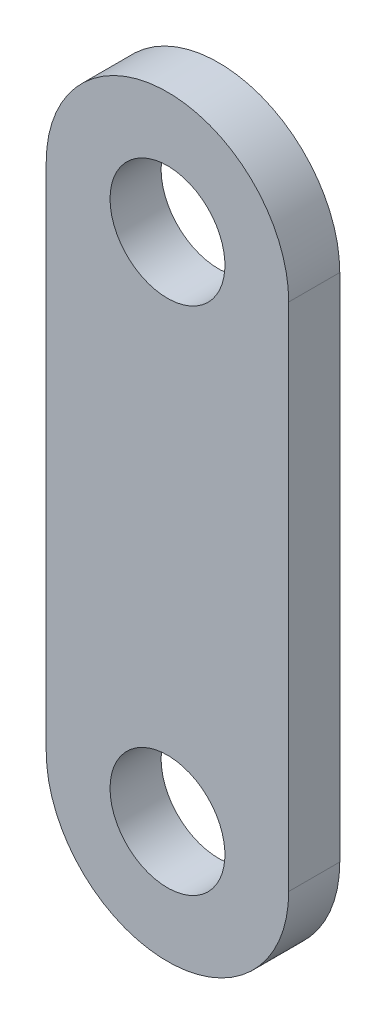
ISO-10303-21;
HEADER;
FILE_DESCRIPTION(('STEP AP214'),'2;1');
FILE_NAME('part.step','',(''),(''),'','','');
FILE_SCHEMA(('AUTOMOTIVE_DESIGN { 1 0 10303 214 1 1 1 1 }'));
ENDSEC;
DATA;
#1=APPLICATION_CONTEXT('core data for automotive mechanical design processes');
#2=APPLICATION_PROTOCOL_DEFINITION('international standard','automotive_design',2000,#1);
#3=PRODUCT_CONTEXT('',#1,'mechanical');
#4=PRODUCT('Part','Part','',(#3));
#5=PRODUCT_RELATED_PRODUCT_CATEGORY('part','',(#4));
#6=PRODUCT_DEFINITION_FORMATION('','',#4);
#7=PRODUCT_DEFINITION_CONTEXT('part definition',#1,'design');
#8=PRODUCT_DEFINITION('design','',#6,#7);
#9=PRODUCT_DEFINITION_SHAPE('','',#8);
#10=(LENGTH_UNIT() NAMED_UNIT(*) SI_UNIT(.MILLI.,.METRE.));
#11=(NAMED_UNIT(*) PLANE_ANGLE_UNIT() SI_UNIT($,.RADIAN.));
#12=(NAMED_UNIT(*) SI_UNIT($,.STERADIAN.) SOLID_ANGLE_UNIT());
#13=UNCERTAINTY_MEASURE_WITH_UNIT(LENGTH_MEASURE(1.E-05),#10,'distance_accuracy_value','');
#14=(GEOMETRIC_REPRESENTATION_CONTEXT(3) GLOBAL_UNCERTAINTY_ASSIGNED_CONTEXT((#13)) GLOBAL_UNIT_ASSIGNED_CONTEXT((#10,
#11,#12)) REPRESENTATION_CONTEXT('',''));
#15=CARTESIAN_POINT('',(0.,0.,0.));
#16=DIRECTION('',(0.,0.,1.));
#17=DIRECTION('',(1.,0.,0.));
#18=AXIS2_PLACEMENT_3D('',#15,#16,#17);
#19=CARTESIAN_POINT('',(0.,-20.,4.));
#20=DIRECTION('',(0.,0.,-1.));
#21=DIRECTION('',(-1.,0.,0.));
#22=AXIS2_PLACEMENT_3D('',#19,#20,#21);
#23=CYLINDRICAL_SURFACE('',#22,9.5);
#24=CARTESIAN_POINT('',(0.,-20.,0.));
#25=DIRECTION('',(0.,0.,1.));
#26=DIRECTION('',(1.,0.,0.));
#27=AXIS2_PLACEMENT_3D('',#24,#25,#26);
#28=CIRCLE('',#27,9.5);
#29=CARTESIAN_POINT('',(-9.49999999999999,-20.,0.));
#30=VERTEX_POINT('',#29);
#31=CARTESIAN_POINT('',(9.50000000000001,-20.,0.));
#32=VERTEX_POINT('',#31);
#33=EDGE_CURVE('E111',#30,#32,#28,.T.);
#34=ORIENTED_EDGE('',*,*,#33,.T.);
#35=DIRECTION('',(0.,0.,-1.));
#36=VECTOR('',#35,1.);
#37=CARTESIAN_POINT('',(9.50000000000001,-20.,4.));
#38=LINE('',#37,#36);
#39=CARTESIAN_POINT('',(9.50000000000001,-20.,4.));
#40=VERTEX_POINT('',#39);
#41=EDGE_CURVE('E13',#40,#32,#38,.T.);
#42=ORIENTED_EDGE('',*,*,#41,.F.);
#43=CARTESIAN_POINT('',(0.,-20.,4.));
#44=DIRECTION('',(0.,0.,1.));
#45=DIRECTION('',(1.,0.,0.));
#46=AXIS2_PLACEMENT_3D('',#43,#44,#45);
#47=CIRCLE('',#46,9.5);
#48=CARTESIAN_POINT('',(-9.49999999999999,-20.,4.));
#49=VERTEX_POINT('',#48);
#50=EDGE_CURVE('E99',#49,#40,#47,.T.);
#51=ORIENTED_EDGE('',*,*,#50,.F.);
#52=DIRECTION('',(0.,0.,-1.));
#53=VECTOR('',#52,1.);
#54=CARTESIAN_POINT('',(-9.49999999999999,-20.,4.));
#55=LINE('',#54,#53);
#56=EDGE_CURVE('E107',#49,#30,#55,.T.);
#57=ORIENTED_EDGE('',*,*,#56,.T.);
#58=EDGE_LOOP('',(#34,#42,#51,#57));
#59=FACE_BOUND('',#58,.T.);
#60=ADVANCED_FACE('F48',(#59),#23,.T.);
#61=CARTESIAN_POINT('',(9.50000000000001,-20.,4.));
#62=DIRECTION('',(-1.,0.,0.));
#63=DIRECTION('',(0.,-1.,0.));
#64=AXIS2_PLACEMENT_3D('',#61,#62,#63);
#65=PLANE('',#64);
#66=DIRECTION('',(0.,1.,0.));
#67=VECTOR('',#66,1.);
#68=CARTESIAN_POINT('',(9.50000000000001,-20.,0.));
#69=LINE('',#68,#67);
#70=CARTESIAN_POINT('',(9.49999999999999,20.,0.));
#71=VERTEX_POINT('',#70);
#72=EDGE_CURVE('E103',#32,#71,#69,.T.);
#73=ORIENTED_EDGE('',*,*,#72,.T.);
#74=DIRECTION('',(0.,0.,-1.));
#75=VECTOR('',#74,1.);
#76=CARTESIAN_POINT('',(9.49999999999999,20.,4.));
#77=LINE('',#76,#75);
#78=CARTESIAN_POINT('',(9.49999999999999,20.,4.));
#79=VERTEX_POINT('',#78);
#80=EDGE_CURVE('E56',#79,#71,#77,.T.);
#81=ORIENTED_EDGE('',*,*,#80,.F.);
#82=DIRECTION('',(0.,1.,0.));
#83=VECTOR('',#82,1.);
#84=CARTESIAN_POINT('',(9.50000000000001,-20.,4.));
#85=LINE('',#84,#83);
#86=EDGE_CURVE('E94',#40,#79,#85,.T.);
#87=ORIENTED_EDGE('',*,*,#86,.F.);
#88=ORIENTED_EDGE('',*,*,#41,.T.);
#89=EDGE_LOOP('',(#73,#81,#87,#88));
#90=FACE_BOUND('',#89,.T.);
#91=ADVANCED_FACE('F102',(#90),#65,.F.);
#92=CARTESIAN_POINT('',(0.,20.,4.));
#93=DIRECTION('',(0.,0.,-1.));
#94=DIRECTION('',(-1.,0.,0.));
#95=AXIS2_PLACEMENT_3D('',#92,#93,#94);
#96=CYLINDRICAL_SURFACE('',#95,9.5);
#97=CARTESIAN_POINT('',(0.,20.,0.));
#98=DIRECTION('',(0.,0.,1.));
#99=DIRECTION('',(1.,0.,0.));
#100=AXIS2_PLACEMENT_3D('',#97,#98,#99);
#101=CIRCLE('',#100,9.5);
#102=CARTESIAN_POINT('',(-9.5,20.,0.));
#103=VERTEX_POINT('',#102);
#104=EDGE_CURVE('E81',#71,#103,#101,.T.);
#105=ORIENTED_EDGE('',*,*,#104,.T.);
#106=DIRECTION('',(0.,0.,-1.));
#107=VECTOR('',#106,1.);
#108=CARTESIAN_POINT('',(-9.5,20.,4.));
#109=LINE('',#108,#107);
#110=CARTESIAN_POINT('',(-9.5,20.,4.));
#111=VERTEX_POINT('',#110);
#112=EDGE_CURVE('E104',#111,#103,#109,.T.);
#113=ORIENTED_EDGE('',*,*,#112,.F.);
#114=CARTESIAN_POINT('',(0.,20.,4.));
#115=DIRECTION('',(0.,0.,1.));
#116=DIRECTION('',(1.,0.,0.));
#117=AXIS2_PLACEMENT_3D('',#114,#115,#116);
#118=CIRCLE('',#117,9.5);
#119=EDGE_CURVE('E97',#79,#111,#118,.T.);
#120=ORIENTED_EDGE('',*,*,#119,.F.);
#121=ORIENTED_EDGE('',*,*,#80,.T.);
#122=EDGE_LOOP('',(#105,#113,#120,#121));
#123=FACE_BOUND('',#122,.T.);
#124=ADVANCED_FACE('F105',(#123),#96,.T.);
#125=CARTESIAN_POINT('',(-9.49999999999999,-20.,4.));
#126=DIRECTION('',(1.,0.,0.));
#127=DIRECTION('',(0.,1.,0.));
#128=AXIS2_PLACEMENT_3D('',#125,#126,#127);
#129=PLANE('',#128);
#130=DIRECTION('',(0.,-1.,0.));
#131=VECTOR('',#130,1.);
#132=CARTESIAN_POINT('',(-9.49999999999999,-20.,0.));
#133=LINE('',#132,#131);
#134=EDGE_CURVE('E87',#103,#30,#133,.T.);
#135=ORIENTED_EDGE('',*,*,#134,.T.);
#136=ORIENTED_EDGE('',*,*,#56,.F.);
#137=DIRECTION('',(0.,-1.,0.));
#138=VECTOR('',#137,1.);
#139=CARTESIAN_POINT('',(-9.49999999999999,-20.,4.));
#140=LINE('',#139,#138);
#141=EDGE_CURVE('E64',#111,#49,#140,.T.);
#142=ORIENTED_EDGE('',*,*,#141,.F.);
#143=ORIENTED_EDGE('',*,*,#112,.T.);
#144=EDGE_LOOP('',(#135,#136,#142,#143));
#145=FACE_BOUND('',#144,.T.);
#146=ADVANCED_FACE('F119',(#145),#129,.F.);
#147=CARTESIAN_POINT('',(0.,-20.,4.));
#148=DIRECTION('',(0.,0.,1.));
#149=DIRECTION('',(1.,0.,0.));
#150=AXIS2_PLACEMENT_3D('',#147,#148,#149);
#151=PLANE('',#150);
#152=CARTESIAN_POINT('',(0.,20.,4.));
#153=DIRECTION('',(0.,0.,-1.));
#154=DIRECTION('',(-1.,0.,0.));
#155=AXIS2_PLACEMENT_3D('',#152,#153,#154);
#156=CIRCLE('',#155,4.49999999999999);
#157=CARTESIAN_POINT('',(-4.49999999999999,20.,4.));
#158=VERTEX_POINT('',#157);
#159=EDGE_CURVE('E114',#158,#158,#156,.T.);
#160=ORIENTED_EDGE('',*,*,#159,.T.);
#161=EDGE_LOOP('',(#160));
#162=FACE_BOUND('',#161,.T.);
#163=CARTESIAN_POINT('',(0.,-20.,4.));
#164=DIRECTION('',(0.,0.,-1.));
#165=DIRECTION('',(-1.,0.,0.));
#166=AXIS2_PLACEMENT_3D('',#163,#164,#165);
#167=CIRCLE('',#166,4.5);
#168=CARTESIAN_POINT('',(-4.5,-20.,4.));
#169=VERTEX_POINT('',#168);
#170=EDGE_CURVE('E128',#169,#169,#167,.T.);
#171=ORIENTED_EDGE('',*,*,#170,.T.);
#172=EDGE_LOOP('',(#171));
#173=FACE_BOUND('',#172,.T.);
#174=ORIENTED_EDGE('',*,*,#50,.T.);
#175=ORIENTED_EDGE('',*,*,#86,.T.);
#176=ORIENTED_EDGE('',*,*,#119,.T.);
#177=ORIENTED_EDGE('',*,*,#141,.T.);
#178=EDGE_LOOP('',(#174,#175,#176,#177));
#179=FACE_BOUND('',#178,.T.);
#180=ADVANCED_FACE('F95',(#162,#173,#179),#151,.T.);
#181=CARTESIAN_POINT('',(0.,-20.,0.));
#182=DIRECTION('',(0.,0.,1.));
#183=DIRECTION('',(1.,0.,0.));
#184=AXIS2_PLACEMENT_3D('',#181,#182,#183);
#185=PLANE('',#184);
#186=CARTESIAN_POINT('',(0.,20.,0.));
#187=DIRECTION('',(0.,0.,-1.));
#188=DIRECTION('',(-1.,0.,0.));
#189=AXIS2_PLACEMENT_3D('',#186,#187,#188);
#190=CIRCLE('',#189,4.49999999999999);
#191=CARTESIAN_POINT('',(-4.49999999999999,20.,0.));
#192=VERTEX_POINT('',#191);
#193=EDGE_CURVE('E131',#192,#192,#190,.T.);
#194=ORIENTED_EDGE('',*,*,#193,.F.);
#195=EDGE_LOOP('',(#194));
#196=FACE_BOUND('',#195,.T.);
#197=CARTESIAN_POINT('',(0.,-20.,0.));
#198=DIRECTION('',(0.,0.,-1.));
#199=DIRECTION('',(-1.,0.,0.));
#200=AXIS2_PLACEMENT_3D('',#197,#198,#199);
#201=CIRCLE('',#200,4.5);
#202=CARTESIAN_POINT('',(-4.5,-20.,0.));
#203=VERTEX_POINT('',#202);
#204=EDGE_CURVE('E125',#203,#203,#201,.T.);
#205=ORIENTED_EDGE('',*,*,#204,.F.);
#206=EDGE_LOOP('',(#205));
#207=FACE_BOUND('',#206,.T.);
#208=ORIENTED_EDGE('',*,*,#33,.F.);
#209=ORIENTED_EDGE('',*,*,#134,.F.);
#210=ORIENTED_EDGE('',*,*,#104,.F.);
#211=ORIENTED_EDGE('',*,*,#72,.F.);
#212=EDGE_LOOP('',(#208,#209,#210,#211));
#213=FACE_BOUND('',#212,.T.);
#214=ADVANCED_FACE('F122',(#196,#207,#213),#185,.F.);
#215=CARTESIAN_POINT('',(0.,-20.,4.));
#216=DIRECTION('',(0.,0.,-1.));
#217=DIRECTION('',(-1.,0.,0.));
#218=AXIS2_PLACEMENT_3D('',#215,#216,#217);
#219=CYLINDRICAL_SURFACE('',#218,4.5);
#220=ORIENTED_EDGE('',*,*,#170,.F.);
#221=EDGE_LOOP('',(#220));
#222=FACE_BOUND('',#221,.T.);
#223=ORIENTED_EDGE('',*,*,#204,.T.);
#224=EDGE_LOOP('',(#223));
#225=FACE_BOUND('',#224,.T.);
#226=ADVANCED_FACE('F142',(#222,#225),#219,.F.);
#227=CARTESIAN_POINT('',(0.,20.,4.));
#228=DIRECTION('',(0.,0.,-1.));
#229=DIRECTION('',(-1.,0.,0.));
#230=AXIS2_PLACEMENT_3D('',#227,#228,#229);
#231=CYLINDRICAL_SURFACE('',#230,4.49999999999999);
#232=ORIENTED_EDGE('',*,*,#159,.F.);
#233=EDGE_LOOP('',(#232));
#234=FACE_BOUND('',#233,.T.);
#235=ORIENTED_EDGE('',*,*,#193,.T.);
#236=EDGE_LOOP('',(#235));
#237=FACE_BOUND('',#236,.T.);
#238=ADVANCED_FACE('F139',(#234,#237),#231,.F.);
#239=CLOSED_SHELL('',(#60,#91,#124,#146,#180,#214,#226,#238));
#240=MANIFOLD_SOLID_BREP('B2',#239);
#241=ADVANCED_BREP_SHAPE_REPRESENTATION('',(#18,#240),#14);
#242=SHAPE_DEFINITION_REPRESENTATION(#9,#241);
ENDSEC;
END-ISO-10303-21;
